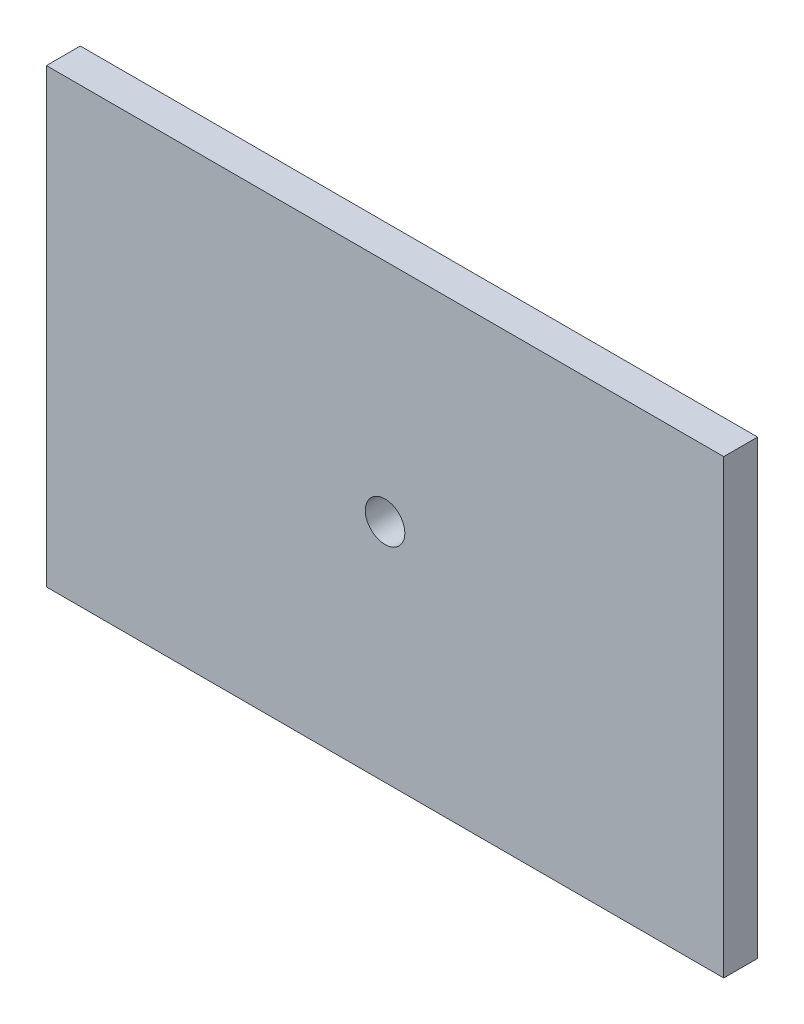
ISO-10303-21;
HEADER;
FILE_DESCRIPTION(('STEP AP214'),'2;1');
FILE_NAME('part.step','',(''),(''),'','','');
FILE_SCHEMA(('AUTOMOTIVE_DESIGN { 1 0 10303 214 1 1 1 1 }'));
ENDSEC;
DATA;
#1=APPLICATION_CONTEXT('core data for automotive mechanical design processes');
#2=APPLICATION_PROTOCOL_DEFINITION('international standard','automotive_design',2000,#1);
#3=PRODUCT_CONTEXT('',#1,'mechanical');
#4=PRODUCT('Part','Part','',(#3));
#5=PRODUCT_RELATED_PRODUCT_CATEGORY('part','',(#4));
#6=PRODUCT_DEFINITION_FORMATION('','',#4);
#7=PRODUCT_DEFINITION_CONTEXT('part definition',#1,'design');
#8=PRODUCT_DEFINITION('design','',#6,#7);
#9=PRODUCT_DEFINITION_SHAPE('','',#8);
#10=(LENGTH_UNIT() NAMED_UNIT(*) SI_UNIT(.MILLI.,.METRE.));
#11=(NAMED_UNIT(*) PLANE_ANGLE_UNIT() SI_UNIT($,.RADIAN.));
#12=(NAMED_UNIT(*) SI_UNIT($,.STERADIAN.) SOLID_ANGLE_UNIT());
#13=UNCERTAINTY_MEASURE_WITH_UNIT(LENGTH_MEASURE(1.E-05),#10,'distance_accuracy_value','');
#14=(GEOMETRIC_REPRESENTATION_CONTEXT(3) GLOBAL_UNCERTAINTY_ASSIGNED_CONTEXT((#13)) GLOBAL_UNIT_ASSIGNED_CONTEXT((#10,
#11,#12)) REPRESENTATION_CONTEXT('',''));
#15=CARTESIAN_POINT('',(0.,0.,0.));
#16=DIRECTION('',(0.,0.,1.));
#17=DIRECTION('',(1.,0.,0.));
#18=AXIS2_PLACEMENT_3D('',#15,#16,#17);
#19=CARTESIAN_POINT('',(-60.,-40.,6.));
#20=DIRECTION('',(1.,0.,0.));
#21=DIRECTION('',(0.,0.,-1.));
#22=AXIS2_PLACEMENT_3D('',#19,#20,#21);
#23=PLANE('',#22);
#24=DIRECTION('',(0.,-1.,0.));
#25=VECTOR('',#24,1.);
#26=CARTESIAN_POINT('',(-60.,-40.,0.));
#27=LINE('',#26,#25);
#28=CARTESIAN_POINT('',(-60.,40.,0.));
#29=VERTEX_POINT('',#28);
#30=CARTESIAN_POINT('',(-60.,-40.,0.));
#31=VERTEX_POINT('',#30);
#32=EDGE_CURVE('E104',#29,#31,#27,.T.);
#33=ORIENTED_EDGE('',*,*,#32,.T.);
#34=DIRECTION('',(0.,0.,-1.));
#35=VECTOR('',#34,1.);
#36=CARTESIAN_POINT('',(-60.,-40.,6.));
#37=LINE('',#36,#35);
#38=CARTESIAN_POINT('',(-60.,-40.,6.));
#39=VERTEX_POINT('',#38);
#40=EDGE_CURVE('E11',#39,#31,#37,.T.);
#41=ORIENTED_EDGE('',*,*,#40,.F.);
#42=DIRECTION('',(0.,-1.,0.));
#43=VECTOR('',#42,1.);
#44=CARTESIAN_POINT('',(-60.,-40.,6.));
#45=LINE('',#44,#43);
#46=CARTESIAN_POINT('',(-60.,40.,6.));
#47=VERTEX_POINT('',#46);
#48=EDGE_CURVE('E91',#47,#39,#45,.T.);
#49=ORIENTED_EDGE('',*,*,#48,.F.);
#50=DIRECTION('',(0.,0.,-1.));
#51=VECTOR('',#50,1.);
#52=CARTESIAN_POINT('',(-60.,40.,6.));
#53=LINE('',#52,#51);
#54=EDGE_CURVE('E100',#47,#29,#53,.T.);
#55=ORIENTED_EDGE('',*,*,#54,.T.);
#56=EDGE_LOOP('',(#33,#41,#49,#55));
#57=FACE_BOUND('',#56,.T.);
#58=ADVANCED_FACE('F39',(#57),#23,.F.);
#59=CARTESIAN_POINT('',(60.,-40.,6.));
#60=DIRECTION('',(0.,1.,0.));
#61=DIRECTION('',(-1.,0.,0.));
#62=AXIS2_PLACEMENT_3D('',#59,#60,#61);
#63=PLANE('',#62);
#64=DIRECTION('',(1.,0.,0.));
#65=VECTOR('',#64,1.);
#66=CARTESIAN_POINT('',(60.,-40.,0.));
#67=LINE('',#66,#65);
#68=CARTESIAN_POINT('',(60.,-40.,0.));
#69=VERTEX_POINT('',#68);
#70=EDGE_CURVE('E95',#31,#69,#67,.T.);
#71=ORIENTED_EDGE('',*,*,#70,.T.);
#72=DIRECTION('',(0.,0.,-1.));
#73=VECTOR('',#72,1.);
#74=CARTESIAN_POINT('',(60.,-40.,6.));
#75=LINE('',#74,#73);
#76=CARTESIAN_POINT('',(60.,-40.,6.));
#77=VERTEX_POINT('',#76);
#78=EDGE_CURVE('E48',#77,#69,#75,.T.);
#79=ORIENTED_EDGE('',*,*,#78,.F.);
#80=DIRECTION('',(1.,0.,0.));
#81=VECTOR('',#80,1.);
#82=CARTESIAN_POINT('',(60.,-40.,6.));
#83=LINE('',#82,#81);
#84=EDGE_CURVE('E86',#39,#77,#83,.T.);
#85=ORIENTED_EDGE('',*,*,#84,.F.);
#86=ORIENTED_EDGE('',*,*,#40,.T.);
#87=EDGE_LOOP('',(#71,#79,#85,#86));
#88=FACE_BOUND('',#87,.T.);
#89=ADVANCED_FACE('F94',(#88),#63,.F.);
#90=CARTESIAN_POINT('',(60.,-40.,6.));
#91=DIRECTION('',(-1.,0.,0.));
#92=DIRECTION('',(0.,0.,1.));
#93=AXIS2_PLACEMENT_3D('',#90,#91,#92);
#94=PLANE('',#93);
#95=DIRECTION('',(0.,1.,0.));
#96=VECTOR('',#95,1.);
#97=CARTESIAN_POINT('',(60.,-40.,0.));
#98=LINE('',#97,#96);
#99=CARTESIAN_POINT('',(60.,40.,0.));
#100=VERTEX_POINT('',#99);
#101=EDGE_CURVE('E73',#69,#100,#98,.T.);
#102=ORIENTED_EDGE('',*,*,#101,.T.);
#103=DIRECTION('',(0.,0.,-1.));
#104=VECTOR('',#103,1.);
#105=CARTESIAN_POINT('',(60.,40.,6.));
#106=LINE('',#105,#104);
#107=CARTESIAN_POINT('',(60.,40.,6.));
#108=VERTEX_POINT('',#107);
#109=EDGE_CURVE('E96',#108,#100,#106,.T.);
#110=ORIENTED_EDGE('',*,*,#109,.F.);
#111=DIRECTION('',(0.,1.,0.));
#112=VECTOR('',#111,1.);
#113=CARTESIAN_POINT('',(60.,-40.,6.));
#114=LINE('',#113,#112);
#115=EDGE_CURVE('E89',#77,#108,#114,.T.);
#116=ORIENTED_EDGE('',*,*,#115,.F.);
#117=ORIENTED_EDGE('',*,*,#78,.T.);
#118=EDGE_LOOP('',(#102,#110,#116,#117));
#119=FACE_BOUND('',#118,.T.);
#120=ADVANCED_FACE('F98',(#119),#94,.F.);
#121=CARTESIAN_POINT('',(60.,40.,6.));
#122=DIRECTION('',(0.,-1.,0.));
#123=DIRECTION('',(1.,0.,0.));
#124=AXIS2_PLACEMENT_3D('',#121,#122,#123);
#125=PLANE('',#124);
#126=DIRECTION('',(-1.,0.,0.));
#127=VECTOR('',#126,1.);
#128=CARTESIAN_POINT('',(60.,40.,0.));
#129=LINE('',#128,#127);
#130=EDGE_CURVE('E79',#100,#29,#129,.T.);
#131=ORIENTED_EDGE('',*,*,#130,.T.);
#132=ORIENTED_EDGE('',*,*,#54,.F.);
#133=DIRECTION('',(-1.,0.,0.));
#134=VECTOR('',#133,1.);
#135=CARTESIAN_POINT('',(60.,40.,6.));
#136=LINE('',#135,#134);
#137=EDGE_CURVE('E56',#108,#47,#136,.T.);
#138=ORIENTED_EDGE('',*,*,#137,.F.);
#139=ORIENTED_EDGE('',*,*,#109,.T.);
#140=EDGE_LOOP('',(#131,#132,#138,#139));
#141=FACE_BOUND('',#140,.T.);
#142=ADVANCED_FACE('F111',(#141),#125,.F.);
#143=CARTESIAN_POINT('',(0.,0.,6.));
#144=DIRECTION('',(0.,0.,1.));
#145=DIRECTION('',(1.,0.,0.));
#146=AXIS2_PLACEMENT_3D('',#143,#144,#145);
#147=PLANE('',#146);
#148=CARTESIAN_POINT('',(0.,0.,6.));
#149=DIRECTION('',(0.,0.,1.));
#150=DIRECTION('',(1.,0.,0.));
#151=AXIS2_PLACEMENT_3D('',#148,#149,#150);
#152=CIRCLE('',#151,3.5);
#153=CARTESIAN_POINT('',(3.5,0.,6.));
#154=VERTEX_POINT('',#153);
#155=EDGE_CURVE('E117',#154,#154,#152,.T.);
#156=ORIENTED_EDGE('',*,*,#155,.F.);
#157=EDGE_LOOP('',(#156));
#158=FACE_BOUND('',#157,.T.);
#159=ORIENTED_EDGE('',*,*,#48,.T.);
#160=ORIENTED_EDGE('',*,*,#84,.T.);
#161=ORIENTED_EDGE('',*,*,#115,.T.);
#162=ORIENTED_EDGE('',*,*,#137,.T.);
#163=EDGE_LOOP('',(#159,#160,#161,#162));
#164=FACE_BOUND('',#163,.T.);
#165=ADVANCED_FACE('F87',(#158,#164),#147,.T.);
#166=CARTESIAN_POINT('',(0.,0.,0.));
#167=DIRECTION('',(0.,0.,1.));
#168=DIRECTION('',(1.,0.,0.));
#169=AXIS2_PLACEMENT_3D('',#166,#167,#168);
#170=PLANE('',#169);
#171=CARTESIAN_POINT('',(0.,0.,0.));
#172=DIRECTION('',(0.,0.,1.));
#173=DIRECTION('',(1.,0.,0.));
#174=AXIS2_PLACEMENT_3D('',#171,#172,#173);
#175=CIRCLE('',#174,3.5);
#176=CARTESIAN_POINT('',(3.5,0.,0.));
#177=VERTEX_POINT('',#176);
#178=EDGE_CURVE('E42',#177,#177,#175,.T.);
#179=ORIENTED_EDGE('',*,*,#178,.T.);
#180=EDGE_LOOP('',(#179));
#181=FACE_BOUND('',#180,.T.);
#182=ORIENTED_EDGE('',*,*,#32,.F.);
#183=ORIENTED_EDGE('',*,*,#130,.F.);
#184=ORIENTED_EDGE('',*,*,#101,.F.);
#185=ORIENTED_EDGE('',*,*,#70,.F.);
#186=EDGE_LOOP('',(#182,#183,#184,#185));
#187=FACE_BOUND('',#186,.T.);
#188=ADVANCED_FACE('F114',(#181,#187),#170,.F.);
#189=CARTESIAN_POINT('',(0.,0.,-1.2E-05));
#190=DIRECTION('',(0.,0.,1.));
#191=DIRECTION('',(1.,0.,0.));
#192=AXIS2_PLACEMENT_3D('',#189,#190,#191);
#193=CYLINDRICAL_SURFACE('',#192,3.5);
#194=CARTESIAN_POINT('',(3.5,0.,6.));
#195=CARTESIAN_POINT('',(3.5,0.,5.9375));
#196=CARTESIAN_POINT('',(3.5,0.,5.875));
#197=CARTESIAN_POINT('',(3.5,0.,5.75));
#198=CARTESIAN_POINT('',(3.5,0.,5.6875));
#199=CARTESIAN_POINT('',(3.5,0.,5.5625));
#200=CARTESIAN_POINT('',(3.5,0.,5.5));
#201=CARTESIAN_POINT('',(3.5,0.,5.375));
#202=CARTESIAN_POINT('',(3.5,0.,5.3125));
#203=CARTESIAN_POINT('',(3.5,0.,5.1875));
#204=CARTESIAN_POINT('',(3.5,0.,5.125));
#205=CARTESIAN_POINT('',(3.5,0.,5.));
#206=CARTESIAN_POINT('',(3.5,0.,4.9375));
#207=CARTESIAN_POINT('',(3.5,0.,4.8125));
#208=CARTESIAN_POINT('',(3.5,0.,4.75));
#209=CARTESIAN_POINT('',(3.5,0.,4.625));
#210=CARTESIAN_POINT('',(3.5,0.,4.5625));
#211=CARTESIAN_POINT('',(3.5,0.,4.4375));
#212=CARTESIAN_POINT('',(3.5,0.,4.375));
#213=CARTESIAN_POINT('',(3.5,0.,4.25));
#214=CARTESIAN_POINT('',(3.5,0.,4.1875));
#215=CARTESIAN_POINT('',(3.5,0.,4.0625));
#216=CARTESIAN_POINT('',(3.5,0.,4.));
#217=CARTESIAN_POINT('',(3.5,0.,3.875));
#218=CARTESIAN_POINT('',(3.5,0.,3.8125));
#219=CARTESIAN_POINT('',(3.5,0.,3.6875));
#220=CARTESIAN_POINT('',(3.5,0.,3.625));
#221=CARTESIAN_POINT('',(3.5,0.,3.5));
#222=CARTESIAN_POINT('',(3.5,0.,3.4375));
#223=CARTESIAN_POINT('',(3.5,0.,3.3125));
#224=CARTESIAN_POINT('',(3.5,0.,3.25));
#225=CARTESIAN_POINT('',(3.5,0.,3.125));
#226=CARTESIAN_POINT('',(3.5,0.,3.0625));
#227=CARTESIAN_POINT('',(3.5,0.,2.9375));
#228=CARTESIAN_POINT('',(3.5,0.,2.875));
#229=CARTESIAN_POINT('',(3.5,0.,2.75));
#230=CARTESIAN_POINT('',(3.5,0.,2.6875));
#231=CARTESIAN_POINT('',(3.5,0.,2.5625));
#232=CARTESIAN_POINT('',(3.5,0.,2.5));
#233=CARTESIAN_POINT('',(3.5,0.,2.375));
#234=CARTESIAN_POINT('',(3.5,0.,2.3125));
#235=CARTESIAN_POINT('',(3.5,0.,2.1875));
#236=CARTESIAN_POINT('',(3.5,0.,2.125));
#237=CARTESIAN_POINT('',(3.5,0.,2.));
#238=CARTESIAN_POINT('',(3.5,0.,1.9375));
#239=CARTESIAN_POINT('',(3.5,0.,1.8125));
#240=CARTESIAN_POINT('',(3.5,0.,1.75));
#241=CARTESIAN_POINT('',(3.5,0.,1.625));
#242=CARTESIAN_POINT('',(3.5,0.,1.5625));
#243=CARTESIAN_POINT('',(3.5,0.,1.4375));
#244=CARTESIAN_POINT('',(3.5,0.,1.375));
#245=CARTESIAN_POINT('',(3.5,0.,1.25));
#246=CARTESIAN_POINT('',(3.5,0.,1.1875));
#247=CARTESIAN_POINT('',(3.5,0.,1.0625));
#248=CARTESIAN_POINT('',(3.5,0.,1.));
#249=CARTESIAN_POINT('',(3.5,0.,0.875));
#250=CARTESIAN_POINT('',(3.5,0.,0.8125));
#251=CARTESIAN_POINT('',(3.5,0.,0.6875));
#252=CARTESIAN_POINT('',(3.5,0.,0.625));
#253=CARTESIAN_POINT('',(3.5,0.,0.5));
#254=CARTESIAN_POINT('',(3.5,0.,0.4375));
#255=CARTESIAN_POINT('',(3.5,0.,0.3125));
#256=CARTESIAN_POINT('',(3.5,0.,0.25));
#257=CARTESIAN_POINT('',(3.5,0.,0.125));
#258=CARTESIAN_POINT('',(3.5,0.,0.0624999999999999));
#259=CARTESIAN_POINT('',(3.5,0.,0.));
#260=B_SPLINE_CURVE_WITH_KNOTS('',3,(#194,#195,#196,#197,#198,#199,#200,#201,#202,#203,#204,
#205,#206,#207,#208,#209,#210,#211,#212,#213,#214,#215,#216,#217,#218,#219,#220,#221,#222,#223,
#224,#225,#226,#227,#228,#229,#230,#231,#232,#233,#234,#235,#236,#237,#238,#239,#240,#241,#242,
#243,#244,#245,#246,#247,#248,#249,#250,#251,#252,#253,#254,#255,#256,#257,#258,#259),
.UNSPECIFIED.,.F.,.F.,(4,2,2,2,2,2,2,2,2,2,2,2,2,2,2,2,2,2,2,2,2,2,2,2,2,2,2,2,2,2,2,2,4),(0.,
0.1875,0.375,0.5625,0.75,0.9375,1.125,1.3125,1.5,1.6875,1.875,2.0625,2.25,2.4375,2.625,2.8125,
3.,3.1875,3.375,3.5625,3.75,3.9375,4.125,4.3125,4.5,4.6875,4.875,5.0625,5.25,5.4375,5.625,
5.8125,6.),.UNSPECIFIED.);
#261=EDGE_CURVE('BSEAM125',#154,#177,#260,.T.);
#262=ORIENTED_EDGE('',*,*,#155,.T.);
#263=ORIENTED_EDGE('',*,*,#178,.F.);
#264=ORIENTED_EDGE('',*,*,#261,.T.);
#265=ORIENTED_EDGE('',*,*,#261,.F.);
#266=EDGE_LOOP('',(#262,#264,#263,#265));
#267=FACE_BOUND('',#266,.T.);
#268=ADVANCED_FACE('F125',(#267),#193,.F.);
#269=CLOSED_SHELL('',(#58,#89,#120,#142,#165,#188,#268));
#270=MANIFOLD_SOLID_BREP('B2',#269);
#271=ADVANCED_BREP_SHAPE_REPRESENTATION('',(#18,#270),#14);
#272=SHAPE_DEFINITION_REPRESENTATION(#9,#271);
ENDSEC;
END-ISO-10303-21;
